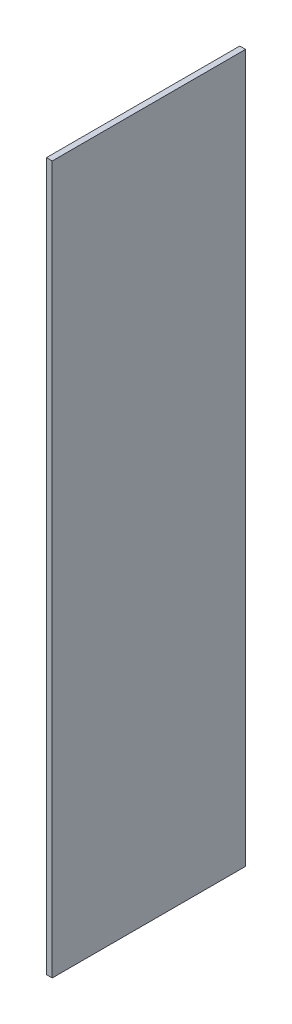
ISO-10303-21;
HEADER;
FILE_DESCRIPTION(('STEP AP214'),'2;1');
FILE_NAME('part.step','',(''),(''),'','','');
FILE_SCHEMA(('AUTOMOTIVE_DESIGN { 1 0 10303 214 1 1 1 1 }'));
ENDSEC;
DATA;
#1=APPLICATION_CONTEXT('core data for automotive mechanical design processes');
#2=APPLICATION_PROTOCOL_DEFINITION('international standard','automotive_design',2000,#1);
#3=PRODUCT_CONTEXT('',#1,'mechanical');
#4=PRODUCT('Part','Part','',(#3));
#5=PRODUCT_RELATED_PRODUCT_CATEGORY('part','',(#4));
#6=PRODUCT_DEFINITION_FORMATION('','',#4);
#7=PRODUCT_DEFINITION_CONTEXT('part definition',#1,'design');
#8=PRODUCT_DEFINITION('design','',#6,#7);
#9=PRODUCT_DEFINITION_SHAPE('','',#8);
#10=(LENGTH_UNIT() NAMED_UNIT(*) SI_UNIT(.MILLI.,.METRE.));
#11=(NAMED_UNIT(*) PLANE_ANGLE_UNIT() SI_UNIT($,.RADIAN.));
#12=(NAMED_UNIT(*) SI_UNIT($,.STERADIAN.) SOLID_ANGLE_UNIT());
#13=UNCERTAINTY_MEASURE_WITH_UNIT(LENGTH_MEASURE(1.E-05),#10,'distance_accuracy_value','');
#14=(GEOMETRIC_REPRESENTATION_CONTEXT(3) GLOBAL_UNCERTAINTY_ASSIGNED_CONTEXT((#13)) GLOBAL_UNIT_ASSIGNED_CONTEXT((#10,
#11,#12)) REPRESENTATION_CONTEXT('',''));
#15=CARTESIAN_POINT('',(0.,0.,0.));
#16=DIRECTION('',(0.,0.,1.));
#17=DIRECTION('',(1.,0.,0.));
#18=AXIS2_PLACEMENT_3D('',#15,#16,#17);
#19=CARTESIAN_POINT('',(15.,0.,0.));
#20=DIRECTION('',(0.,0.,-1.));
#21=DIRECTION('',(-1.,0.,0.));
#22=AXIS2_PLACEMENT_3D('',#19,#20,#21);
#23=PLANE('',#22);
#24=DIRECTION('',(0.,-1.,0.));
#25=VECTOR('',#24,1.);
#26=CARTESIAN_POINT('',(0.,0.,0.));
#27=LINE('',#26,#25);
#28=CARTESIAN_POINT('',(0.,1830.,0.));
#29=VERTEX_POINT('',#28);
#30=CARTESIAN_POINT('',(0.,0.,0.));
#31=VERTEX_POINT('',#30);
#32=EDGE_CURVE('E96',#29,#31,#27,.T.);
#33=ORIENTED_EDGE('',*,*,#32,.T.);
#34=DIRECTION('',(-1.,0.,0.));
#35=VECTOR('',#34,1.);
#36=CARTESIAN_POINT('',(15.,0.,0.));
#37=LINE('',#36,#35);
#38=CARTESIAN_POINT('',(15.,0.,0.));
#39=VERTEX_POINT('',#38);
#40=EDGE_CURVE('E11',#39,#31,#37,.T.);
#41=ORIENTED_EDGE('',*,*,#40,.F.);
#42=DIRECTION('',(0.,-1.,0.));
#43=VECTOR('',#42,1.);
#44=CARTESIAN_POINT('',(15.,0.,0.));
#45=LINE('',#44,#43);
#46=CARTESIAN_POINT('',(15.,1830.,0.));
#47=VERTEX_POINT('',#46);
#48=EDGE_CURVE('E84',#47,#39,#45,.T.);
#49=ORIENTED_EDGE('',*,*,#48,.F.);
#50=DIRECTION('',(-1.,0.,0.));
#51=VECTOR('',#50,1.);
#52=CARTESIAN_POINT('',(15.,1830.,0.));
#53=LINE('',#52,#51);
#54=EDGE_CURVE('E92',#47,#29,#53,.T.);
#55=ORIENTED_EDGE('',*,*,#54,.T.);
#56=EDGE_LOOP('',(#33,#41,#49,#55));
#57=FACE_BOUND('',#56,.T.);
#58=ADVANCED_FACE('F33',(#57),#23,.F.);
#59=CARTESIAN_POINT('',(15.,0.,0.));
#60=DIRECTION('',(0.,1.,0.));
#61=DIRECTION('',(0.,0.,1.));
#62=AXIS2_PLACEMENT_3D('',#59,#60,#61);
#63=PLANE('',#62);
#64=DIRECTION('',(0.,0.,-1.));
#65=VECTOR('',#64,1.);
#66=CARTESIAN_POINT('',(0.,0.,0.));
#67=LINE('',#66,#65);
#68=CARTESIAN_POINT('',(0.,0.,-500.));
#69=VERTEX_POINT('',#68);
#70=EDGE_CURVE('E88',#31,#69,#67,.T.);
#71=ORIENTED_EDGE('',*,*,#70,.T.);
#72=DIRECTION('',(-1.,0.,0.));
#73=VECTOR('',#72,1.);
#74=CARTESIAN_POINT('',(15.,0.,-500.));
#75=LINE('',#74,#73);
#76=CARTESIAN_POINT('',(15.,0.,-500.));
#77=VERTEX_POINT('',#76);
#78=EDGE_CURVE('E41',#77,#69,#75,.T.);
#79=ORIENTED_EDGE('',*,*,#78,.F.);
#80=DIRECTION('',(0.,0.,-1.));
#81=VECTOR('',#80,1.);
#82=CARTESIAN_POINT('',(15.,0.,0.));
#83=LINE('',#82,#81);
#84=EDGE_CURVE('E79',#39,#77,#83,.T.);
#85=ORIENTED_EDGE('',*,*,#84,.F.);
#86=ORIENTED_EDGE('',*,*,#40,.T.);
#87=EDGE_LOOP('',(#71,#79,#85,#86));
#88=FACE_BOUND('',#87,.T.);
#89=ADVANCED_FACE('F87',(#88),#63,.F.);
#90=CARTESIAN_POINT('',(15.,0.,-500.));
#91=DIRECTION('',(0.,0.,1.));
#92=DIRECTION('',(1.,0.,0.));
#93=AXIS2_PLACEMENT_3D('',#90,#91,#92);
#94=PLANE('',#93);
#95=DIRECTION('',(0.,1.,0.));
#96=VECTOR('',#95,1.);
#97=CARTESIAN_POINT('',(0.,0.,-500.));
#98=LINE('',#97,#96);
#99=CARTESIAN_POINT('',(0.,1830.,-500.));
#100=VERTEX_POINT('',#99);
#101=EDGE_CURVE('E66',#69,#100,#98,.T.);
#102=ORIENTED_EDGE('',*,*,#101,.T.);
#103=DIRECTION('',(-1.,0.,0.));
#104=VECTOR('',#103,1.);
#105=CARTESIAN_POINT('',(15.,1830.,-500.));
#106=LINE('',#105,#104);
#107=CARTESIAN_POINT('',(15.,1830.,-500.));
#108=VERTEX_POINT('',#107);
#109=EDGE_CURVE('E89',#108,#100,#106,.T.);
#110=ORIENTED_EDGE('',*,*,#109,.F.);
#111=DIRECTION('',(0.,1.,0.));
#112=VECTOR('',#111,1.);
#113=CARTESIAN_POINT('',(15.,0.,-500.));
#114=LINE('',#113,#112);
#115=EDGE_CURVE('E82',#77,#108,#114,.T.);
#116=ORIENTED_EDGE('',*,*,#115,.F.);
#117=ORIENTED_EDGE('',*,*,#78,.T.);
#118=EDGE_LOOP('',(#102,#110,#116,#117));
#119=FACE_BOUND('',#118,.T.);
#120=ADVANCED_FACE('F90',(#119),#94,.F.);
#121=CARTESIAN_POINT('',(15.,1830.,0.));
#122=DIRECTION('',(0.,-1.,0.));
#123=DIRECTION('',(0.,0.,-1.));
#124=AXIS2_PLACEMENT_3D('',#121,#122,#123);
#125=PLANE('',#124);
#126=DIRECTION('',(0.,0.,1.));
#127=VECTOR('',#126,1.);
#128=CARTESIAN_POINT('',(0.,1830.,0.));
#129=LINE('',#128,#127);
#130=EDGE_CURVE('E72',#100,#29,#129,.T.);
#131=ORIENTED_EDGE('',*,*,#130,.T.);
#132=ORIENTED_EDGE('',*,*,#54,.F.);
#133=DIRECTION('',(0.,0.,1.));
#134=VECTOR('',#133,1.);
#135=CARTESIAN_POINT('',(15.,1830.,0.));
#136=LINE('',#135,#134);
#137=EDGE_CURVE('E49',#108,#47,#136,.T.);
#138=ORIENTED_EDGE('',*,*,#137,.F.);
#139=ORIENTED_EDGE('',*,*,#109,.T.);
#140=EDGE_LOOP('',(#131,#132,#138,#139));
#141=FACE_BOUND('',#140,.T.);
#142=ADVANCED_FACE('F103',(#141),#125,.F.);
#143=CARTESIAN_POINT('',(15.,0.,0.));
#144=DIRECTION('',(-1.,0.,0.));
#145=DIRECTION('',(0.,0.,1.));
#146=AXIS2_PLACEMENT_3D('',#143,#144,#145);
#147=PLANE('',#146);
#148=ORIENTED_EDGE('',*,*,#48,.T.);
#149=ORIENTED_EDGE('',*,*,#84,.T.);
#150=ORIENTED_EDGE('',*,*,#115,.T.);
#151=ORIENTED_EDGE('',*,*,#137,.T.);
#152=EDGE_LOOP('',(#148,#149,#150,#151));
#153=FACE_BOUND('',#152,.T.);
#154=ADVANCED_FACE('F80',(#153),#147,.F.);
#155=CARTESIAN_POINT('',(0.,0.,0.));
#156=DIRECTION('',(-1.,0.,0.));
#157=DIRECTION('',(0.,0.,1.));
#158=AXIS2_PLACEMENT_3D('',#155,#156,#157);
#159=PLANE('',#158);
#160=ORIENTED_EDGE('',*,*,#32,.F.);
#161=ORIENTED_EDGE('',*,*,#130,.F.);
#162=ORIENTED_EDGE('',*,*,#101,.F.);
#163=ORIENTED_EDGE('',*,*,#70,.F.);
#164=EDGE_LOOP('',(#160,#161,#162,#163));
#165=FACE_BOUND('',#164,.T.);
#166=ADVANCED_FACE('F106',(#165),#159,.T.);
#167=CLOSED_SHELL('',(#58,#89,#120,#142,#154,#166));
#168=MANIFOLD_SOLID_BREP('B2',#167);
#169=ADVANCED_BREP_SHAPE_REPRESENTATION('',(#18,#168),#14);
#170=SHAPE_DEFINITION_REPRESENTATION(#9,#169);
ENDSEC;
END-ISO-10303-21;
